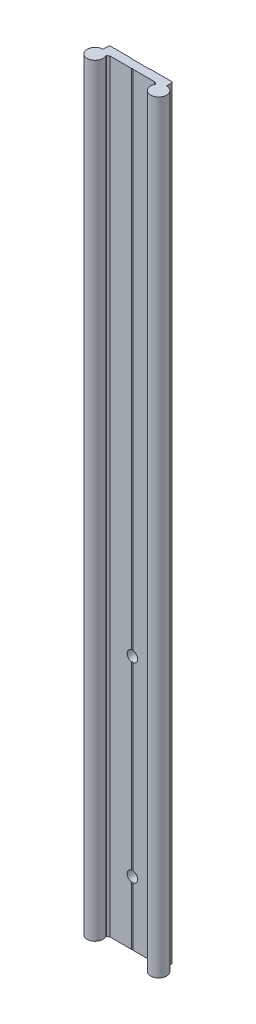
ISO-10303-21;
HEADER;
FILE_DESCRIPTION(('STEP AP214'),'2;1');
FILE_NAME('part.step','',(''),(''),'','','');
FILE_SCHEMA(('AUTOMOTIVE_DESIGN { 1 0 10303 214 1 1 1 1 }'));
ENDSEC;
DATA;
#1=APPLICATION_CONTEXT('core data for automotive mechanical design processes');
#2=APPLICATION_PROTOCOL_DEFINITION('international standard','automotive_design',2000,#1);
#3=PRODUCT_CONTEXT('',#1,'mechanical');
#4=PRODUCT('Part','Part','',(#3));
#5=PRODUCT_RELATED_PRODUCT_CATEGORY('part','',(#4));
#6=PRODUCT_DEFINITION_FORMATION('','',#4);
#7=PRODUCT_DEFINITION_CONTEXT('part definition',#1,'design');
#8=PRODUCT_DEFINITION('design','',#6,#7);
#9=PRODUCT_DEFINITION_SHAPE('','',#8);
#10=(LENGTH_UNIT() NAMED_UNIT(*) SI_UNIT(.MILLI.,.METRE.));
#11=(NAMED_UNIT(*) PLANE_ANGLE_UNIT() SI_UNIT($,.RADIAN.));
#12=(NAMED_UNIT(*) SI_UNIT($,.STERADIAN.) SOLID_ANGLE_UNIT());
#13=UNCERTAINTY_MEASURE_WITH_UNIT(LENGTH_MEASURE(1.E-05),#10,'distance_accuracy_value','');
#14=(GEOMETRIC_REPRESENTATION_CONTEXT(3) GLOBAL_UNCERTAINTY_ASSIGNED_CONTEXT((#13)) GLOBAL_UNIT_ASSIGNED_CONTEXT((#10,
#11,#12)) REPRESENTATION_CONTEXT('',''));
#15=CARTESIAN_POINT('',(0.,0.,0.));
#16=DIRECTION('',(0.,0.,1.));
#17=DIRECTION('',(1.,0.,0.));
#18=AXIS2_PLACEMENT_3D('',#15,#16,#17);
#19=CARTESIAN_POINT('',(19.75,0.,0.25));
#20=DIRECTION('',(0.707106781186548,0.,-0.707106781186548));
#21=DIRECTION('',(-0.707106781186548,0.,-0.707106781186548));
#22=AXIS2_PLACEMENT_3D('',#19,#20,#21);
#23=PLANE('',#22);
#24=DIRECTION('',(-0.707106781186548,0.,-0.707106781186548));
#25=VECTOR('',#24,1.);
#26=CARTESIAN_POINT('',(19.75,0.,0.25));
#27=LINE('',#26,#25);
#28=CARTESIAN_POINT('',(20.,0.,0.5));
#29=VERTEX_POINT('',#28);
#30=CARTESIAN_POINT('',(19.5,0.,0.));
#31=VERTEX_POINT('',#30);
#32=EDGE_CURVE('E123',#29,#31,#27,.T.);
#33=ORIENTED_EDGE('',*,*,#32,.T.);
#34=DIRECTION('',(0.,1.,0.));
#35=VECTOR('',#34,1.);
#36=CARTESIAN_POINT('',(19.5,0.,0.));
#37=LINE('',#36,#35);
#38=CARTESIAN_POINT('',(19.5,480.,0.));
#39=VERTEX_POINT('',#38);
#40=EDGE_CURVE('E376',#39,#31,#37,.F.);
#41=ORIENTED_EDGE('',*,*,#40,.F.);
#42=DIRECTION('',(-0.707106781186547,0.,-0.707106781186547));
#43=VECTOR('',#42,1.);
#44=CARTESIAN_POINT('',(20.,480.,0.5));
#45=LINE('',#44,#43);
#46=CARTESIAN_POINT('',(20.,480.,0.5));
#47=VERTEX_POINT('',#46);
#48=EDGE_CURVE('E293',#47,#39,#45,.T.);
#49=ORIENTED_EDGE('',*,*,#48,.F.);
#50=DIRECTION('',(0.,1.,0.));
#51=VECTOR('',#50,1.);
#52=CARTESIAN_POINT('',(20.,0.,0.5));
#53=LINE('',#52,#51);
#54=EDGE_CURVE('E368',#29,#47,#53,.T.);
#55=ORIENTED_EDGE('',*,*,#54,.F.);
#56=EDGE_LOOP('',(#33,#41,#49,#55));
#57=FACE_BOUND('',#56,.T.);
#58=ADVANCED_FACE('F32',(#57),#23,.T.);
#59=CARTESIAN_POINT('',(20.3,0.,3.70849738));
#60=DIRECTION('',(0.,1.,0.));
#61=DIRECTION('',(0.,0.,1.));
#62=AXIS2_PLACEMENT_3D('',#59,#60,#61);
#63=CYLINDRICAL_SURFACE('',#62,0.300000003500001);
#64=DIRECTION('',(0.,1.,0.));
#65=VECTOR('',#64,1.);
#66=CARTESIAN_POINT('',(20.2830188700676,0.,4.00801639874632));
#67=LINE('',#66,#65);
#68=CARTESIAN_POINT('',(20.2830188688936,0.,4.00801639929363));
#69=VERTEX_POINT('',#68);
#70=CARTESIAN_POINT('',(20.2830188689836,480.,4.00801639770649));
#71=VERTEX_POINT('',#70);
#72=EDGE_CURVE('E366',#69,#71,#67,.T.);
#73=ORIENTED_EDGE('',*,*,#72,.F.);
#74=CARTESIAN_POINT('',(20.3,0.,3.70849738));
#75=DIRECTION('',(0.,1.,0.));
#76=DIRECTION('',(0.,0.,1.));
#77=AXIS2_PLACEMENT_3D('',#74,#75,#76);
#78=CIRCLE('',#77,0.300000003500001);
#79=CARTESIAN_POINT('',(20.,0.,3.70849738));
#80=VERTEX_POINT('',#79);
#81=EDGE_CURVE('E35',#80,#69,#78,.T.);
#82=ORIENTED_EDGE('',*,*,#81,.F.);
#83=DIRECTION('',(0.,1.,0.));
#84=VECTOR('',#83,1.);
#85=CARTESIAN_POINT('',(20.,0.,3.70849738));
#86=LINE('',#85,#84);
#87=CARTESIAN_POINT('',(19.9999999982714,480.,3.70849738));
#88=VERTEX_POINT('',#87);
#89=EDGE_CURVE('E369',#88,#80,#86,.F.);
#90=ORIENTED_EDGE('',*,*,#89,.F.);
#91=CARTESIAN_POINT('',(20.3,480.,3.70849738));
#92=DIRECTION('',(0.,-1.,0.));
#93=DIRECTION('',(0.,0.,1.));
#94=AXIS2_PLACEMENT_3D('',#91,#92,#93);
#95=CIRCLE('',#94,0.300000001728561);
#96=EDGE_CURVE('E287',#71,#88,#95,.T.);
#97=ORIENTED_EDGE('',*,*,#96,.F.);
#98=EDGE_LOOP('',(#73,#82,#90,#97));
#99=FACE_BOUND('',#98,.T.);
#100=ADVANCED_FACE('F491',(#99),#63,.F.);
#101=CARTESIAN_POINT('',(15.28152165,0.,6.58629703));
#102=DIRECTION('',(0.,1.,0.));
#103=DIRECTION('',(0.,0.,1.));
#104=AXIS2_PLACEMENT_3D('',#101,#102,#103);
#105=CYLINDRICAL_SURFACE('',#104,0.299999998999998);
#106=DIRECTION('',(0.,1.,0.));
#107=VECTOR('',#106,1.);
#108=CARTESIAN_POINT('',(15.43152165,0.,6.32648941));
#109=LINE('',#108,#107);
#110=CARTESIAN_POINT('',(15.4315216497557,0.,6.32648940985894));
#111=VERTEX_POINT('',#110);
#112=CARTESIAN_POINT('',(15.4315216497557,480.,6.32648940985894));
#113=VERTEX_POINT('',#112);
#114=EDGE_CURVE('E411',#111,#113,#109,.T.);
#115=ORIENTED_EDGE('',*,*,#114,.F.);
#116=CARTESIAN_POINT('',(15.28152165,0.,6.58629703));
#117=DIRECTION('',(0.,1.,0.));
#118=DIRECTION('',(0.,0.,1.));
#119=AXIS2_PLACEMENT_3D('',#116,#117,#118);
#120=CIRCLE('',#119,0.299999998999998);
#121=CARTESIAN_POINT('',(15.5486053297196,0.,6.72292172801594));
#122=VERTEX_POINT('',#121);
#123=EDGE_CURVE('E417',#122,#111,#120,.T.);
#124=ORIENTED_EDGE('',*,*,#123,.F.);
#125=DIRECTION('',(0.,1.,0.));
#126=VECTOR('',#125,1.);
#127=CARTESIAN_POINT('',(15.5486053299831,0.,6.72292172999147));
#128=LINE('',#127,#126);
#129=CARTESIAN_POINT('',(15.5486053289735,480.,6.72292172763426));
#130=VERTEX_POINT('',#129);
#131=EDGE_CURVE('E363',#130,#122,#128,.F.);
#132=ORIENTED_EDGE('',*,*,#131,.F.);
#133=CARTESIAN_POINT('',(15.28152165,480.,6.58629703));
#134=DIRECTION('',(0.,-1.,0.));
#135=DIRECTION('',(0.,0.,1.));
#136=AXIS2_PLACEMENT_3D('',#133,#134,#135);
#137=CIRCLE('',#136,0.299999999296135);
#138=EDGE_CURVE('E281',#113,#130,#137,.T.);
#139=ORIENTED_EDGE('',*,*,#138,.F.);
#140=EDGE_LOOP('',(#115,#124,#132,#139));
#141=FACE_BOUND('',#140,.T.);
#142=ADVANCED_FACE('F499',(#141),#105,.F.);
#143=CARTESIAN_POINT('',(0.25,0.,5.355662435));
#144=DIRECTION('',(-0.499999994031163,0.,0.866025407230548));
#145=DIRECTION('',(0.866025407230548,0.,0.499999994031163));
#146=AXIS2_PLACEMENT_3D('',#143,#144,#145);
#147=PLANE('',#146);
#148=CARTESIAN_POINT('',(0.,40.,5.21132487));
#149=DIRECTION('',(-0.499999994031163,0.,0.866025407230548));
#150=DIRECTION('',(-0.866025407230548,0.,-0.499999994031163));
#151=AXIS2_PLACEMENT_3D('',#148,#149,#150);
#152=ELLIPSE('',#151,3.81051176148865,3.3);
#153=CARTESIAN_POINT('',(0.,43.3,5.21132487));
#154=VERTEX_POINT('',#153);
#155=CARTESIAN_POINT('',(0.499999999999999,43.26190128606,5.5));
#156=VERTEX_POINT('',#155);
#157=EDGE_CURVE('E390',#154,#156,#152,.F.);
#158=ORIENTED_EDGE('',*,*,#157,.T.);
#159=DIRECTION('',(0.,1.,0.));
#160=VECTOR('',#159,1.);
#161=CARTESIAN_POINT('',(0.5,0.,5.5));
#162=LINE('',#161,#160);
#163=CARTESIAN_POINT('',(0.499999999999999,156.73809871394,5.5));
#164=VERTEX_POINT('',#163);
#165=EDGE_CURVE('E359',#164,#156,#162,.F.);
#166=ORIENTED_EDGE('',*,*,#165,.F.);
#167=CARTESIAN_POINT('',(0.,160.,5.21132487));
#168=DIRECTION('',(-0.499999994031163,0.,0.866025407230548));
#169=DIRECTION('',(-0.866025407230548,0.,-0.499999994031163));
#170=AXIS2_PLACEMENT_3D('',#167,#168,#169);
#171=ELLIPSE('',#170,3.81051176148865,3.3);
#172=CARTESIAN_POINT('',(0.,156.7,5.21132487));
#173=VERTEX_POINT('',#172);
#174=EDGE_CURVE('E393',#164,#173,#171,.F.);
#175=ORIENTED_EDGE('',*,*,#174,.T.);
#176=DIRECTION('',(0.,1.,0.));
#177=VECTOR('',#176,1.);
#178=CARTESIAN_POINT('',(0.,0.,5.21132487));
#179=LINE('',#178,#177);
#180=EDGE_CURVE('E394',#154,#173,#179,.T.);
#181=ORIENTED_EDGE('',*,*,#180,.F.);
#182=EDGE_LOOP('',(#158,#166,#175,#181));
#183=FACE_BOUND('',#182,.T.);
#184=ADVANCED_FACE('F806',(#183),#147,.T.);
#185=CARTESIAN_POINT('',(0.25,0.,5.355662435));
#186=DIRECTION('',(-0.499999994031163,0.,0.866025407230548));
#187=DIRECTION('',(0.866025407230548,0.,0.499999994031163));
#188=AXIS2_PLACEMENT_3D('',#185,#186,#187);
#189=PLANE('',#188);
#190=DIRECTION('',(0.866025407230548,0.,0.499999994031163));
#191=VECTOR('',#190,1.);
#192=CARTESIAN_POINT('',(0.25,0.,5.355662435));
#193=LINE('',#192,#191);
#194=CARTESIAN_POINT('',(0.,0.,5.21132487));
#195=VERTEX_POINT('',#194);
#196=CARTESIAN_POINT('',(0.5,0.,5.5));
#197=VERTEX_POINT('',#196);
#198=EDGE_CURVE('E414',#195,#197,#193,.T.);
#199=ORIENTED_EDGE('',*,*,#198,.T.);
#200=DIRECTION('',(0.,1.,0.));
#201=VECTOR('',#200,1.);
#202=CARTESIAN_POINT('',(0.5,0.,5.5));
#203=LINE('',#202,#201);
#204=CARTESIAN_POINT('',(0.499999999999999,36.73809871394,5.5));
#205=VERTEX_POINT('',#204);
#206=EDGE_CURVE('E353',#205,#197,#203,.F.);
#207=ORIENTED_EDGE('',*,*,#206,.F.);
#208=CARTESIAN_POINT('',(0.,40.,5.21132487));
#209=DIRECTION('',(-0.499999994031163,0.,0.866025407230548));
#210=DIRECTION('',(-0.866025407230548,0.,-0.499999994031163));
#211=AXIS2_PLACEMENT_3D('',#208,#209,#210);
#212=ELLIPSE('',#211,3.81051176148865,3.3);
#213=CARTESIAN_POINT('',(0.,36.7,5.21132487));
#214=VERTEX_POINT('',#213);
#215=EDGE_CURVE('E476',#205,#214,#212,.F.);
#216=ORIENTED_EDGE('',*,*,#215,.T.);
#217=DIRECTION('',(0.,1.,0.));
#218=VECTOR('',#217,1.);
#219=CARTESIAN_POINT('',(0.,0.,5.21132487));
#220=LINE('',#219,#218);
#221=EDGE_CURVE('E399',#195,#214,#220,.T.);
#222=ORIENTED_EDGE('',*,*,#221,.F.);
#223=EDGE_LOOP('',(#199,#207,#216,#222));
#224=FACE_BOUND('',#223,.T.);
#225=ADVANCED_FACE('F510',(#224),#189,.T.);
#226=CARTESIAN_POINT('',(14.715760825,0.,5.913244705));
#227=DIRECTION('',(-0.500000000009856,0.,0.866025403778748));
#228=DIRECTION('',(0.866025403778748,0.,0.500000000009856));
#229=AXIS2_PLACEMENT_3D('',#226,#227,#228);
#230=PLANE('',#229);
#231=DIRECTION('',(0.866025403778748,0.,0.500000000009856));
#232=VECTOR('',#231,1.);
#233=CARTESIAN_POINT('',(14.715760825,0.,5.913244705));
#234=LINE('',#233,#232);
#235=CARTESIAN_POINT('',(14.,0.,5.5));
#236=VERTEX_POINT('',#235);
#237=EDGE_CURVE('E416',#236,#111,#234,.T.);
#238=ORIENTED_EDGE('',*,*,#237,.T.);
#239=ORIENTED_EDGE('',*,*,#114,.T.);
#240=DIRECTION('',(0.866025403778748,0.,0.500000000009856));
#241=VECTOR('',#240,1.);
#242=CARTESIAN_POINT('',(14.,480.,5.5));
#243=LINE('',#242,#241);
#244=CARTESIAN_POINT('',(14.,480.,5.5));
#245=VERTEX_POINT('',#244);
#246=EDGE_CURVE('E278',#245,#113,#243,.T.);
#247=ORIENTED_EDGE('',*,*,#246,.F.);
#248=DIRECTION('',(0.,1.,0.));
#249=VECTOR('',#248,1.);
#250=CARTESIAN_POINT('',(14.,0.,5.5));
#251=LINE('',#250,#249);
#252=EDGE_CURVE('E350',#236,#245,#251,.T.);
#253=ORIENTED_EDGE('',*,*,#252,.F.);
#254=EDGE_LOOP('',(#238,#239,#247,#253));
#255=FACE_BOUND('',#254,.T.);
#256=ADVANCED_FACE('F502',(#255),#230,.T.);
#257=CARTESIAN_POINT('',(0.25,0.,5.355662435));
#258=DIRECTION('',(-0.499999994031163,0.,0.866025407230548));
#259=DIRECTION('',(0.866025407230548,0.,0.499999994031163));
#260=AXIS2_PLACEMENT_3D('',#257,#258,#259);
#261=PLANE('',#260);
#262=DIRECTION('',(0.,1.,0.));
#263=VECTOR('',#262,1.);
#264=CARTESIAN_POINT('',(0.5,0.,5.5));
#265=LINE('',#264,#263);
#266=CARTESIAN_POINT('',(0.5,480.,5.5));
#267=VERTEX_POINT('',#266);
#268=CARTESIAN_POINT('',(0.499999999999999,163.26190128606,5.5));
#269=VERTEX_POINT('',#268);
#270=EDGE_CURVE('E347',#267,#269,#265,.F.);
#271=ORIENTED_EDGE('',*,*,#270,.F.);
#272=DIRECTION('',(0.866025407230549,0.,0.499999994031162));
#273=VECTOR('',#272,1.);
#274=CARTESIAN_POINT('',(0.,480.,5.21132487));
#275=LINE('',#274,#273);
#276=CARTESIAN_POINT('',(0.,480.,5.21132487));
#277=VERTEX_POINT('',#276);
#278=EDGE_CURVE('E272',#277,#267,#275,.T.);
#279=ORIENTED_EDGE('',*,*,#278,.F.);
#280=DIRECTION('',(0.,1.,0.));
#281=VECTOR('',#280,1.);
#282=CARTESIAN_POINT('',(0.,0.,5.21132487));
#283=LINE('',#282,#281);
#284=CARTESIAN_POINT('',(0.,163.3,5.21132487));
#285=VERTEX_POINT('',#284);
#286=EDGE_CURVE('E407',#285,#277,#283,.T.);
#287=ORIENTED_EDGE('',*,*,#286,.F.);
#288=CARTESIAN_POINT('',(0.,160.,5.21132487));
#289=DIRECTION('',(-0.499999994031163,0.,0.866025407230548));
#290=DIRECTION('',(-0.866025407230548,0.,-0.499999994031163));
#291=AXIS2_PLACEMENT_3D('',#288,#289,#290);
#292=ELLIPSE('',#291,3.81051176148865,3.3);
#293=EDGE_CURVE('E478',#285,#269,#292,.F.);
#294=ORIENTED_EDGE('',*,*,#293,.T.);
#295=EDGE_LOOP('',(#271,#279,#287,#294));
#296=FACE_BOUND('',#295,.T.);
#297=ADVANCED_FACE('F594',(#296),#261,.T.);
#298=CARTESIAN_POINT('',(-0.25,0.,5.355662435));
#299=DIRECTION('',(0.499999994031163,0.,0.866025407230548));
#300=DIRECTION('',(0.866025407230548,0.,-0.499999994031163));
#301=AXIS2_PLACEMENT_3D('',#298,#299,#300);
#302=PLANE('',#301);
#303=ORIENTED_EDGE('',*,*,#286,.T.);
#304=DIRECTION('',(0.866025407230549,0.,-0.499999994031162));
#305=VECTOR('',#304,1.);
#306=CARTESIAN_POINT('',(-0.5,480.,5.5));
#307=LINE('',#306,#305);
#308=CARTESIAN_POINT('',(-0.5,480.,5.5));
#309=VERTEX_POINT('',#308);
#310=EDGE_CURVE('E269',#309,#277,#307,.T.);
#311=ORIENTED_EDGE('',*,*,#310,.F.);
#312=DIRECTION('',(0.,1.,0.));
#313=VECTOR('',#312,1.);
#314=CARTESIAN_POINT('',(-0.5,0.,5.5));
#315=LINE('',#314,#313);
#316=CARTESIAN_POINT('',(-0.499999999999999,163.26190128606,5.5));
#317=VERTEX_POINT('',#316);
#318=EDGE_CURVE('E342',#317,#309,#315,.T.);
#319=ORIENTED_EDGE('',*,*,#318,.F.);
#320=CARTESIAN_POINT('',(0.,160.,5.21132487));
#321=DIRECTION('',(0.499999994031163,0.,0.866025407230548));
#322=DIRECTION('',(0.866025407230548,0.,-0.499999994031163));
#323=AXIS2_PLACEMENT_3D('',#320,#321,#322);
#324=ELLIPSE('',#323,3.81051176148865,3.3);
#325=EDGE_CURVE('E481',#317,#285,#324,.F.);
#326=ORIENTED_EDGE('',*,*,#325,.T.);
#327=EDGE_LOOP('',(#303,#311,#319,#326));
#328=FACE_BOUND('',#327,.T.);
#329=ADVANCED_FACE('F602',(#328),#302,.T.);
#330=CARTESIAN_POINT('',(-0.25,0.,5.355662435));
#331=DIRECTION('',(0.499999994031163,0.,0.866025407230548));
#332=DIRECTION('',(0.866025407230548,0.,-0.499999994031163));
#333=AXIS2_PLACEMENT_3D('',#330,#331,#332);
#334=PLANE('',#333);
#335=DIRECTION('',(0.866025407230548,0.,-0.499999994031163));
#336=VECTOR('',#335,1.);
#337=CARTESIAN_POINT('',(-0.25,0.,5.355662435));
#338=LINE('',#337,#336);
#339=CARTESIAN_POINT('',(-0.5,0.,5.5));
#340=VERTEX_POINT('',#339);
#341=EDGE_CURVE('E402',#340,#195,#338,.T.);
#342=ORIENTED_EDGE('',*,*,#341,.T.);
#343=ORIENTED_EDGE('',*,*,#221,.T.);
#344=CARTESIAN_POINT('',(0.,40.,5.21132487));
#345=DIRECTION('',(0.499999994031163,0.,0.866025407230548));
#346=DIRECTION('',(0.866025407230548,0.,-0.499999994031163));
#347=AXIS2_PLACEMENT_3D('',#344,#345,#346);
#348=ELLIPSE('',#347,3.81051176148865,3.3);
#349=CARTESIAN_POINT('',(-0.499999999999999,36.73809871394,5.5));
#350=VERTEX_POINT('',#349);
#351=EDGE_CURVE('E473',#214,#350,#348,.F.);
#352=ORIENTED_EDGE('',*,*,#351,.T.);
#353=DIRECTION('',(0.,1.,0.));
#354=VECTOR('',#353,1.);
#355=CARTESIAN_POINT('',(-0.5,0.,5.5));
#356=LINE('',#355,#354);
#357=EDGE_CURVE('E336',#340,#350,#356,.T.);
#358=ORIENTED_EDGE('',*,*,#357,.F.);
#359=EDGE_LOOP('',(#342,#343,#352,#358));
#360=FACE_BOUND('',#359,.T.);
#361=ADVANCED_FACE('F514',(#360),#334,.T.);
#362=CARTESIAN_POINT('',(-0.25,0.,5.355662435));
#363=DIRECTION('',(0.499999994031163,0.,0.866025407230548));
#364=DIRECTION('',(0.866025407230548,0.,-0.499999994031163));
#365=AXIS2_PLACEMENT_3D('',#362,#363,#364);
#366=PLANE('',#365);
#367=CARTESIAN_POINT('',(0.,40.,5.21132487));
#368=DIRECTION('',(0.499999994031163,0.,0.866025407230548));
#369=DIRECTION('',(0.866025407230548,0.,-0.499999994031163));
#370=AXIS2_PLACEMENT_3D('',#367,#368,#369);
#371=ELLIPSE('',#370,3.81051176148865,3.3);
#372=CARTESIAN_POINT('',(-0.499999999999999,43.26190128606,5.5));
#373=VERTEX_POINT('',#372);
#374=EDGE_CURVE('E470',#373,#154,#371,.F.);
#375=ORIENTED_EDGE('',*,*,#374,.T.);
#376=ORIENTED_EDGE('',*,*,#180,.T.);
#377=CARTESIAN_POINT('',(0.,160.,5.21132487));
#378=DIRECTION('',(0.499999994031163,0.,0.866025407230548));
#379=DIRECTION('',(0.866025407230548,0.,-0.499999994031163));
#380=AXIS2_PLACEMENT_3D('',#377,#378,#379);
#381=ELLIPSE('',#380,3.81051176148865,3.3);
#382=CARTESIAN_POINT('',(-0.499999999999999,156.73809871394,5.5));
#383=VERTEX_POINT('',#382);
#384=EDGE_CURVE('E484',#173,#383,#381,.F.);
#385=ORIENTED_EDGE('',*,*,#384,.T.);
#386=DIRECTION('',(0.,1.,0.));
#387=VECTOR('',#386,1.);
#388=CARTESIAN_POINT('',(-0.5,0.,5.5));
#389=LINE('',#388,#387);
#390=EDGE_CURVE('E326',#373,#383,#389,.T.);
#391=ORIENTED_EDGE('',*,*,#390,.F.);
#392=EDGE_LOOP('',(#375,#376,#385,#391));
#393=FACE_BOUND('',#392,.T.);
#394=ADVANCED_FACE('F615',(#393),#366,.T.);
#395=CARTESIAN_POINT('',(-19.75,0.,0.25));
#396=DIRECTION('',(-0.707106781186548,0.,-0.707106781186548));
#397=DIRECTION('',(-0.707106781186548,0.,0.707106781186548));
#398=AXIS2_PLACEMENT_3D('',#395,#396,#397);
#399=PLANE('',#398);
#400=DIRECTION('',(-0.707106781186548,0.,0.707106781186548));
#401=VECTOR('',#400,1.);
#402=CARTESIAN_POINT('',(-19.75,0.,0.25));
#403=LINE('',#402,#401);
#404=CARTESIAN_POINT('',(-19.5,0.,0.));
#405=VERTEX_POINT('',#404);
#406=CARTESIAN_POINT('',(-20.,0.,0.5));
#407=VERTEX_POINT('',#406);
#408=EDGE_CURVE('E391',#405,#407,#403,.T.);
#409=ORIENTED_EDGE('',*,*,#408,.T.);
#410=DIRECTION('',(0.,1.,0.));
#411=VECTOR('',#410,1.);
#412=CARTESIAN_POINT('',(-20.,0.,0.5));
#413=LINE('',#412,#411);
#414=CARTESIAN_POINT('',(-20.,480.,0.5));
#415=VERTEX_POINT('',#414);
#416=EDGE_CURVE('E323',#415,#407,#413,.F.);
#417=ORIENTED_EDGE('',*,*,#416,.F.);
#418=DIRECTION('',(-0.707106781186548,0.,0.707106781186547));
#419=VECTOR('',#418,1.);
#420=CARTESIAN_POINT('',(-19.5,480.,0.));
#421=LINE('',#420,#419);
#422=CARTESIAN_POINT('',(-19.5,480.,0.));
#423=VERTEX_POINT('',#422);
#424=EDGE_CURVE('E248',#423,#415,#421,.T.);
#425=ORIENTED_EDGE('',*,*,#424,.F.);
#426=DIRECTION('',(0.,1.,0.));
#427=VECTOR('',#426,1.);
#428=CARTESIAN_POINT('',(-19.5,0.,0.));
#429=LINE('',#428,#427);
#430=EDGE_CURVE('E320',#405,#423,#429,.T.);
#431=ORIENTED_EDGE('',*,*,#430,.F.);
#432=EDGE_LOOP('',(#409,#417,#425,#431));
#433=FACE_BOUND('',#432,.T.);
#434=ADVANCED_FACE('F542',(#433),#399,.T.);
#435=CARTESIAN_POINT('',(0.,160.,2.85));
#436=DIRECTION('',(0.,0.,-1.));
#437=DIRECTION('',(-1.,0.,0.));
#438=AXIS2_PLACEMENT_3D('',#435,#436,#437);
#439=CYLINDRICAL_SURFACE('',#438,3.3);
#440=CARTESIAN_POINT('',(0.,160.,5.5));
#441=DIRECTION('',(0.,0.,-1.));
#442=DIRECTION('',(-1.,0.,0.));
#443=AXIS2_PLACEMENT_3D('',#440,#441,#442);
#444=CIRCLE('',#443,3.3);
#445=EDGE_CURVE('E344',#383,#317,#444,.T.);
#446=ORIENTED_EDGE('',*,*,#445,.F.);
#447=ORIENTED_EDGE('',*,*,#384,.F.);
#448=ORIENTED_EDGE('',*,*,#174,.F.);
#449=CARTESIAN_POINT('',(0.,160.,5.5));
#450=DIRECTION('',(0.,0.,-1.));
#451=DIRECTION('',(-1.,0.,0.));
#452=AXIS2_PLACEMENT_3D('',#449,#450,#451);
#453=CIRCLE('',#452,3.3);
#454=EDGE_CURVE('E362',#269,#164,#453,.T.);
#455=ORIENTED_EDGE('',*,*,#454,.F.);
#456=ORIENTED_EDGE('',*,*,#293,.F.);
#457=ORIENTED_EDGE('',*,*,#325,.F.);
#458=EDGE_LOOP('',(#446,#447,#448,#455,#456,#457));
#459=FACE_BOUND('',#458,.T.);
#460=CARTESIAN_POINT('',(0.,160.,0.2));
#461=DIRECTION('',(0.,0.,-1.));
#462=DIRECTION('',(-1.,0.,0.));
#463=AXIS2_PLACEMENT_3D('',#460,#461,#462);
#464=CIRCLE('',#463,3.3);
#465=CARTESIAN_POINT('',(-3.3,160.,0.2));
#466=VERTEX_POINT('',#465);
#467=EDGE_CURVE('E428',#466,#466,#464,.F.);
#468=ORIENTED_EDGE('',*,*,#467,.F.);
#469=EDGE_LOOP('',(#468));
#470=FACE_BOUND('',#469,.T.);
#471=ADVANCED_FACE('F636',(#459,#470),#439,.F.);
#472=CARTESIAN_POINT('',(0.,40.,2.85));
#473=DIRECTION('',(0.,0.,-1.));
#474=DIRECTION('',(-1.,0.,0.));
#475=AXIS2_PLACEMENT_3D('',#472,#473,#474);
#476=CYLINDRICAL_SURFACE('',#475,3.3);
#477=CARTESIAN_POINT('',(0.,40.,5.5));
#478=DIRECTION('',(0.,0.,-1.));
#479=DIRECTION('',(-1.,0.,0.));
#480=AXIS2_PLACEMENT_3D('',#477,#478,#479);
#481=CIRCLE('',#480,3.3);
#482=EDGE_CURVE('E335',#350,#373,#481,.T.);
#483=ORIENTED_EDGE('',*,*,#482,.F.);
#484=ORIENTED_EDGE('',*,*,#351,.F.);
#485=ORIENTED_EDGE('',*,*,#215,.F.);
#486=CARTESIAN_POINT('',(0.,40.,5.5));
#487=DIRECTION('',(0.,0.,-1.));
#488=DIRECTION('',(-1.,0.,0.));
#489=AXIS2_PLACEMENT_3D('',#486,#487,#488);
#490=CIRCLE('',#489,3.3);
#491=EDGE_CURVE('E356',#156,#205,#490,.T.);
#492=ORIENTED_EDGE('',*,*,#491,.F.);
#493=ORIENTED_EDGE('',*,*,#157,.F.);
#494=ORIENTED_EDGE('',*,*,#374,.F.);
#495=EDGE_LOOP('',(#483,#484,#485,#492,#493,#494));
#496=FACE_BOUND('',#495,.T.);
#497=CARTESIAN_POINT('',(0.,40.,0.2));
#498=DIRECTION('',(0.,0.,-1.));
#499=DIRECTION('',(-1.,0.,0.));
#500=AXIS2_PLACEMENT_3D('',#497,#498,#499);
#501=CIRCLE('',#500,3.3);
#502=CARTESIAN_POINT('',(-3.3,40.,0.2));
#503=VERTEX_POINT('',#502);
#504=EDGE_CURVE('E318',#503,#503,#501,.F.);
#505=ORIENTED_EDGE('',*,*,#504,.F.);
#506=EDGE_LOOP('',(#505));
#507=FACE_BOUND('',#506,.T.);
#508=ADVANCED_FACE('F650',(#496,#507),#476,.F.);
#509=CARTESIAN_POINT('',(5.9,0.,0.1));
#510=DIRECTION('',(-0.707106781186547,0.,-0.707106781186548));
#511=DIRECTION('',(-0.707106781186548,0.,0.707106781186547));
#512=AXIS2_PLACEMENT_3D('',#509,#510,#511);
#513=PLANE('',#512);
#514=DIRECTION('',(-0.707106781186548,0.,0.707106781186547));
#515=VECTOR('',#514,1.);
#516=CARTESIAN_POINT('',(5.9,0.,0.1));
#517=LINE('',#516,#515);
#518=CARTESIAN_POINT('',(6.,0.,0.));
#519=VERTEX_POINT('',#518);
#520=CARTESIAN_POINT('',(5.8,0.,0.2));
#521=VERTEX_POINT('',#520);
#522=EDGE_CURVE('E388',#519,#521,#517,.T.);
#523=ORIENTED_EDGE('',*,*,#522,.T.);
#524=DIRECTION('',(0.,1.,0.));
#525=VECTOR('',#524,1.);
#526=CARTESIAN_POINT('',(5.8,0.,0.2));
#527=LINE('',#526,#525);
#528=CARTESIAN_POINT('',(5.8,480.,0.2));
#529=VERTEX_POINT('',#528);
#530=EDGE_CURVE('E228',#529,#521,#527,.F.);
#531=ORIENTED_EDGE('',*,*,#530,.F.);
#532=DIRECTION('',(-0.707106781186549,0.,0.707106781186546));
#533=VECTOR('',#532,1.);
#534=CARTESIAN_POINT('',(6.,480.,0.));
#535=LINE('',#534,#533);
#536=CARTESIAN_POINT('',(6.,480.,0.));
#537=VERTEX_POINT('',#536);
#538=EDGE_CURVE('E244',#537,#529,#535,.T.);
#539=ORIENTED_EDGE('',*,*,#538,.F.);
#540=DIRECTION('',(0.,1.,0.));
#541=VECTOR('',#540,1.);
#542=CARTESIAN_POINT('',(6.,0.,0.));
#543=LINE('',#542,#541);
#544=EDGE_CURVE('E371',#519,#537,#543,.T.);
#545=ORIENTED_EDGE('',*,*,#544,.F.);
#546=EDGE_LOOP('',(#523,#531,#539,#545));
#547=FACE_BOUND('',#546,.T.);
#548=ADVANCED_FACE('F644',(#547),#513,.T.);
#549=CARTESIAN_POINT('',(-5.9,0.,0.1));
#550=DIRECTION('',(0.707106781186547,0.,-0.707106781186548));
#551=DIRECTION('',(-0.707106781186548,0.,-0.707106781186547));
#552=AXIS2_PLACEMENT_3D('',#549,#550,#551);
#553=PLANE('',#552);
#554=DIRECTION('',(-0.707106781186548,0.,-0.707106781186547));
#555=VECTOR('',#554,1.);
#556=CARTESIAN_POINT('',(-5.9,0.,0.1));
#557=LINE('',#556,#555);
#558=CARTESIAN_POINT('',(-5.8,0.,0.2));
#559=VERTEX_POINT('',#558);
#560=CARTESIAN_POINT('',(-6.,0.,0.));
#561=VERTEX_POINT('',#560);
#562=EDGE_CURVE('E385',#559,#561,#557,.T.);
#563=ORIENTED_EDGE('',*,*,#562,.T.);
#564=DIRECTION('',(0.,1.,0.));
#565=VECTOR('',#564,1.);
#566=CARTESIAN_POINT('',(-6.,0.,0.));
#567=LINE('',#566,#565);
#568=CARTESIAN_POINT('',(-6.,480.,0.));
#569=VERTEX_POINT('',#568);
#570=EDGE_CURVE('E234',#569,#561,#567,.F.);
#571=ORIENTED_EDGE('',*,*,#570,.F.);
#572=DIRECTION('',(-0.707106781186549,0.,-0.707106781186546));
#573=VECTOR('',#572,1.);
#574=CARTESIAN_POINT('',(-5.8,480.,0.2));
#575=LINE('',#574,#573);
#576=CARTESIAN_POINT('',(-5.8,480.,0.2));
#577=VERTEX_POINT('',#576);
#578=EDGE_CURVE('E231',#577,#569,#575,.T.);
#579=ORIENTED_EDGE('',*,*,#578,.F.);
#580=DIRECTION('',(0.,1.,0.));
#581=VECTOR('',#580,1.);
#582=CARTESIAN_POINT('',(-5.8,0.,0.2));
#583=LINE('',#582,#581);
#584=EDGE_CURVE('E217',#559,#577,#583,.T.);
#585=ORIENTED_EDGE('',*,*,#584,.F.);
#586=EDGE_LOOP('',(#563,#571,#579,#585));
#587=FACE_BOUND('',#586,.T.);
#588=ADVANCED_FACE('F232',(#587),#553,.T.);
#589=CARTESIAN_POINT('',(-20.3,0.,3.70849738));
#590=DIRECTION('',(0.,1.,0.));
#591=DIRECTION('',(0.,0.,1.));
#592=AXIS2_PLACEMENT_3D('',#589,#590,#591);
#593=CYLINDRICAL_SURFACE('',#592,0.299999999999997);
#594=DIRECTION('',(0.,1.,0.));
#595=VECTOR('',#594,1.);
#596=CARTESIAN_POINT('',(-20.,0.,3.70849738));
#597=LINE('',#596,#595);
#598=CARTESIAN_POINT('',(-20.,0.,3.70849738));
#599=VERTEX_POINT('',#598);
#600=CARTESIAN_POINT('',(-20.,480.,3.70849738));
#601=VERTEX_POINT('',#600);
#602=EDGE_CURVE('E321',#599,#601,#597,.T.);
#603=ORIENTED_EDGE('',*,*,#602,.F.);
#604=CARTESIAN_POINT('',(-20.3,0.,3.70849738));
#605=DIRECTION('',(0.,1.,0.));
#606=DIRECTION('',(0.,0.,1.));
#607=AXIS2_PLACEMENT_3D('',#604,#605,#606);
#608=CIRCLE('',#607,0.299999999999997);
#609=CARTESIAN_POINT('',(-20.2830188689741,0.,4.00801639818839));
#610=VERTEX_POINT('',#609);
#611=EDGE_CURVE('E387',#610,#599,#608,.T.);
#612=ORIENTED_EDGE('',*,*,#611,.F.);
#613=DIRECTION('',(0.,1.,0.));
#614=VECTOR('',#613,1.);
#615=CARTESIAN_POINT('',(-20.2830188699984,0.,4.00801640002843));
#616=LINE('',#615,#614);
#617=CARTESIAN_POINT('',(-20.2830188690496,480.,4.00801639685621));
#618=VERTEX_POINT('',#617);
#619=EDGE_CURVE('E227',#618,#610,#616,.F.);
#620=ORIENTED_EDGE('',*,*,#619,.F.);
#621=CARTESIAN_POINT('',(-20.3,480.,3.70849738));
#622=DIRECTION('',(0.,-1.,0.));
#623=DIRECTION('',(0.,0.,1.));
#624=AXIS2_PLACEMENT_3D('',#621,#622,#623);
#625=CIRCLE('',#624,0.300000000444776);
#626=EDGE_CURVE('E254',#601,#618,#625,.T.);
#627=ORIENTED_EDGE('',*,*,#626,.F.);
#628=EDGE_LOOP('',(#603,#612,#620,#627));
#629=FACE_BOUND('',#628,.T.);
#630=ADVANCED_FACE('F533',(#629),#593,.F.);
#631=CARTESIAN_POINT('',(-14.715760825,0.,5.91324470499998));
#632=DIRECTION('',(0.500000000009856,0.,0.866025403778748));
#633=DIRECTION('',(0.866025403778748,0.,-0.500000000009856));
#634=AXIS2_PLACEMENT_3D('',#631,#632,#633);
#635=PLANE('',#634);
#636=DIRECTION('',(-0.866025404469381,0.,0.499999998813646));
#637=VECTOR('',#636,1.);
#638=CARTESIAN_POINT('',(-14.,0.,5.5));
#639=LINE('',#638,#637);
#640=CARTESIAN_POINT('',(-14.,0.,5.5));
#641=VERTEX_POINT('',#640);
#642=CARTESIAN_POINT('',(-15.4315216507178,0.,6.326489407778));
#643=VERTEX_POINT('',#642);
#644=EDGE_CURVE('E303',#641,#643,#639,.T.);
#645=ORIENTED_EDGE('',*,*,#644,.F.);
#646=DIRECTION('',(0.,1.,0.));
#647=VECTOR('',#646,1.);
#648=CARTESIAN_POINT('',(-14.,0.,5.5));
#649=LINE('',#648,#647);
#650=CARTESIAN_POINT('',(-14.,480.,5.5));
#651=VERTEX_POINT('',#650);
#652=EDGE_CURVE('E339',#651,#641,#649,.F.);
#653=ORIENTED_EDGE('',*,*,#652,.F.);
#654=DIRECTION('',(0.866025403980827,0.,-0.499999999659846));
#655=VECTOR('',#654,1.);
#656=CARTESIAN_POINT('',(-15.4315216500897,480.,6.32648940928034));
#657=LINE('',#656,#655);
#658=CARTESIAN_POINT('',(-15.4315216494878,480.,6.3264894103228));
#659=VERTEX_POINT('',#658);
#660=EDGE_CURVE('E263',#659,#651,#657,.T.);
#661=ORIENTED_EDGE('',*,*,#660,.F.);
#662=DIRECTION('',(0.,1.,0.));
#663=VECTOR('',#662,1.);
#664=CARTESIAN_POINT('',(-15.4315216511415,0.,6.32648940802261));
#665=LINE('',#664,#663);
#666=EDGE_CURVE('E331',#659,#643,#665,.F.);
#667=ORIENTED_EDGE('',*,*,#666,.T.);
#668=EDGE_LOOP('',(#645,#653,#661,#667));
#669=FACE_BOUND('',#668,.T.);
#670=ADVANCED_FACE('F522',(#669),#635,.T.);
#671=CARTESIAN_POINT('',(12.75,0.,0.));
#672=DIRECTION('',(0.,0.,-1.));
#673=DIRECTION('',(-1.,0.,0.));
#674=AXIS2_PLACEMENT_3D('',#671,#672,#673);
#675=PLANE('',#674);
#676=DIRECTION('',(1.,0.,0.));
#677=VECTOR('',#676,1.);
#678=CARTESIAN_POINT('',(-7.7796083811088E-09,0.,0.));
#679=LINE('',#678,#677);
#680=EDGE_CURVE('E313',#519,#31,#679,.T.);
#681=ORIENTED_EDGE('',*,*,#680,.F.);
#682=ORIENTED_EDGE('',*,*,#544,.T.);
#683=DIRECTION('',(-1.,0.,0.));
#684=VECTOR('',#683,1.);
#685=CARTESIAN_POINT('',(19.5,480.,0.));
#686=LINE('',#685,#684);
#687=EDGE_CURVE('E296',#39,#537,#686,.T.);
#688=ORIENTED_EDGE('',*,*,#687,.F.);
#689=ORIENTED_EDGE('',*,*,#40,.T.);
#690=EDGE_LOOP('',(#681,#682,#688,#689));
#691=FACE_BOUND('',#690,.T.);
#692=ADVANCED_FACE('F683',(#691),#675,.T.);
#693=CARTESIAN_POINT('',(20.,0.,2.10424869));
#694=DIRECTION('',(1.,0.,0.));
#695=DIRECTION('',(0.,0.,-1.));
#696=AXIS2_PLACEMENT_3D('',#693,#694,#695);
#697=PLANE('',#696);
#698=DIRECTION('',(0.,0.,-1.));
#699=VECTOR('',#698,1.);
#700=CARTESIAN_POINT('',(20.,0.,5.21921116449749));
#701=LINE('',#700,#699);
#702=EDGE_CURVE('E310',#29,#80,#701,.F.);
#703=ORIENTED_EDGE('',*,*,#702,.F.);
#704=ORIENTED_EDGE('',*,*,#54,.T.);
#705=DIRECTION('',(4.49916864020629E-10,0.,-1.));
#706=VECTOR('',#705,1.);
#707=CARTESIAN_POINT('',(19.9999999985564,480.,3.70849738));
#708=LINE('',#707,#706);
#709=EDGE_CURVE('E290',#88,#47,#708,.T.);
#710=ORIENTED_EDGE('',*,*,#709,.F.);
#711=ORIENTED_EDGE('',*,*,#89,.T.);
#712=EDGE_LOOP('',(#703,#704,#710,#711));
#713=FACE_BOUND('',#712,.T.);
#714=ADVANCED_FACE('F694',(#713),#697,.T.);
#715=CARTESIAN_POINT('',(20.,0.,9.00000000000001));
#716=DIRECTION('',(0.,1.,0.));
#717=DIRECTION('',(0.,0.,1.));
#718=AXIS2_PLACEMENT_3D('',#715,#716,#717);
#719=CYLINDRICAL_SURFACE('',#718,4.99999999560001);
#720=ORIENTED_EDGE('',*,*,#131,.T.);
#721=CARTESIAN_POINT('',(20.,0.,9.00000000000001));
#722=DIRECTION('',(0.,1.,0.));
#723=DIRECTION('',(0.,0.,1.));
#724=AXIS2_PLACEMENT_3D('',#721,#722,#723);
#725=CIRCLE('',#724,4.99999999560001);
#726=EDGE_CURVE('E312',#69,#122,#725,.F.);
#727=ORIENTED_EDGE('',*,*,#726,.F.);
#728=ORIENTED_EDGE('',*,*,#72,.T.);
#729=CARTESIAN_POINT('',(20.,480.,9.00000000000001));
#730=DIRECTION('',(0.,1.,0.));
#731=DIRECTION('',(0.,0.,1.));
#732=AXIS2_PLACEMENT_3D('',#729,#730,#731);
#733=CIRCLE('',#732,4.99999999657682);
#734=EDGE_CURVE('E284',#130,#71,#733,.T.);
#735=ORIENTED_EDGE('',*,*,#734,.F.);
#736=EDGE_LOOP('',(#720,#727,#728,#735));
#737=FACE_BOUND('',#736,.T.);
#738=ADVANCED_FACE('F494',(#737),#719,.T.);
#739=CARTESIAN_POINT('',(7.25,0.,5.5));
#740=DIRECTION('',(0.,0.,1.));
#741=DIRECTION('',(1.,0.,0.));
#742=AXIS2_PLACEMENT_3D('',#739,#740,#741);
#743=PLANE('',#742);
#744=ORIENTED_EDGE('',*,*,#252,.T.);
#745=DIRECTION('',(1.,0.,0.));
#746=VECTOR('',#745,1.);
#747=CARTESIAN_POINT('',(0.5,480.,5.5));
#748=LINE('',#747,#746);
#749=EDGE_CURVE('E275',#267,#245,#748,.T.);
#750=ORIENTED_EDGE('',*,*,#749,.F.);
#751=ORIENTED_EDGE('',*,*,#270,.T.);
#752=ORIENTED_EDGE('',*,*,#454,.T.);
#753=ORIENTED_EDGE('',*,*,#165,.T.);
#754=ORIENTED_EDGE('',*,*,#491,.T.);
#755=ORIENTED_EDGE('',*,*,#206,.T.);
#756=DIRECTION('',(1.,0.,0.));
#757=VECTOR('',#756,1.);
#758=CARTESIAN_POINT('',(-7.7796083811088E-09,0.,5.5));
#759=LINE('',#758,#757);
#760=EDGE_CURVE('E379',#236,#197,#759,.F.);
#761=ORIENTED_EDGE('',*,*,#760,.F.);
#762=EDGE_LOOP('',(#744,#750,#751,#752,#753,#754,#755,#761));
#763=FACE_BOUND('',#762,.T.);
#764=ADVANCED_FACE('F506',(#763),#743,.T.);
#765=CARTESIAN_POINT('',(-7.25,0.,5.5));
#766=DIRECTION('',(0.,0.,1.));
#767=DIRECTION('',(1.,0.,0.));
#768=AXIS2_PLACEMENT_3D('',#765,#766,#767);
#769=PLANE('',#768);
#770=ORIENTED_EDGE('',*,*,#482,.T.);
#771=ORIENTED_EDGE('',*,*,#390,.T.);
#772=ORIENTED_EDGE('',*,*,#445,.T.);
#773=ORIENTED_EDGE('',*,*,#318,.T.);
#774=DIRECTION('',(1.,0.,0.));
#775=VECTOR('',#774,1.);
#776=CARTESIAN_POINT('',(-14.,480.,5.5));
#777=LINE('',#776,#775);
#778=EDGE_CURVE('E266',#651,#309,#777,.T.);
#779=ORIENTED_EDGE('',*,*,#778,.F.);
#780=ORIENTED_EDGE('',*,*,#652,.T.);
#781=DIRECTION('',(1.,0.,0.));
#782=VECTOR('',#781,1.);
#783=CARTESIAN_POINT('',(-7.7796083811088E-09,0.,5.5));
#784=LINE('',#783,#782);
#785=EDGE_CURVE('E307',#340,#641,#784,.F.);
#786=ORIENTED_EDGE('',*,*,#785,.F.);
#787=ORIENTED_EDGE('',*,*,#357,.T.);
#788=EDGE_LOOP('',(#770,#771,#772,#773,#779,#780,#786,#787));
#789=FACE_BOUND('',#788,.T.);
#790=ADVANCED_FACE('F518',(#789),#769,.T.);
#791=CARTESIAN_POINT('',(-20.,0.,2.10424869));
#792=DIRECTION('',(-1.,0.,0.));
#793=DIRECTION('',(0.,0.,1.));
#794=AXIS2_PLACEMENT_3D('',#791,#792,#793);
#795=PLANE('',#794);
#796=DIRECTION('',(0.,0.,-1.));
#797=VECTOR('',#796,1.);
#798=CARTESIAN_POINT('',(-20.,0.,5.21921116449749));
#799=LINE('',#798,#797);
#800=EDGE_CURVE('E299',#599,#407,#799,.T.);
#801=ORIENTED_EDGE('',*,*,#800,.F.);
#802=ORIENTED_EDGE('',*,*,#602,.T.);
#803=DIRECTION('',(0.,0.,1.));
#804=VECTOR('',#803,1.);
#805=CARTESIAN_POINT('',(-20.,480.,0.5));
#806=LINE('',#805,#804);
#807=EDGE_CURVE('E251',#415,#601,#806,.T.);
#808=ORIENTED_EDGE('',*,*,#807,.F.);
#809=ORIENTED_EDGE('',*,*,#416,.T.);
#810=EDGE_LOOP('',(#801,#802,#808,#809));
#811=FACE_BOUND('',#810,.T.);
#812=ADVANCED_FACE('F537',(#811),#795,.T.);
#813=CARTESIAN_POINT('',(-12.75,0.,0.));
#814=DIRECTION('',(0.,0.,-1.));
#815=DIRECTION('',(-1.,0.,0.));
#816=AXIS2_PLACEMENT_3D('',#813,#814,#815);
#817=PLANE('',#816);
#818=DIRECTION('',(1.,0.,0.));
#819=VECTOR('',#818,1.);
#820=CARTESIAN_POINT('',(-7.7796083811088E-09,0.,0.));
#821=LINE('',#820,#819);
#822=EDGE_CURVE('E302',#405,#561,#821,.T.);
#823=ORIENTED_EDGE('',*,*,#822,.F.);
#824=ORIENTED_EDGE('',*,*,#430,.T.);
#825=DIRECTION('',(-1.,0.,0.));
#826=VECTOR('',#825,1.);
#827=CARTESIAN_POINT('',(-6.,480.,0.));
#828=LINE('',#827,#826);
#829=EDGE_CURVE('E238',#569,#423,#828,.T.);
#830=ORIENTED_EDGE('',*,*,#829,.F.);
#831=ORIENTED_EDGE('',*,*,#570,.T.);
#832=EDGE_LOOP('',(#823,#824,#830,#831));
#833=FACE_BOUND('',#832,.T.);
#834=ADVANCED_FACE('F544',(#833),#817,.T.);
#835=CARTESIAN_POINT('',(2.9,0.,0.2));
#836=DIRECTION('',(0.,0.,-1.));
#837=DIRECTION('',(-1.,0.,0.));
#838=AXIS2_PLACEMENT_3D('',#835,#836,#837);
#839=PLANE('',#838);
#840=DIRECTION('',(1.,0.,0.));
#841=VECTOR('',#840,1.);
#842=CARTESIAN_POINT('',(-7.7796083811088E-09,0.,0.2));
#843=LINE('',#842,#841);
#844=EDGE_CURVE('E225',#559,#521,#843,.T.);
#845=ORIENTED_EDGE('',*,*,#844,.F.);
#846=ORIENTED_EDGE('',*,*,#584,.T.);
#847=DIRECTION('',(-1.,0.,0.));
#848=VECTOR('',#847,1.);
#849=CARTESIAN_POINT('',(5.8,480.,0.2));
#850=LINE('',#849,#848);
#851=EDGE_CURVE('E223',#529,#577,#850,.T.);
#852=ORIENTED_EDGE('',*,*,#851,.F.);
#853=ORIENTED_EDGE('',*,*,#530,.T.);
#854=EDGE_LOOP('',(#845,#846,#852,#853));
#855=FACE_BOUND('',#854,.T.);
#856=ORIENTED_EDGE('',*,*,#504,.T.);
#857=EDGE_LOOP('',(#856));
#858=FACE_BOUND('',#857,.T.);
#859=ORIENTED_EDGE('',*,*,#467,.T.);
#860=EDGE_LOOP('',(#859));
#861=FACE_BOUND('',#860,.T.);
#862=ADVANCED_FACE('F219',(#855,#858,#861),#839,.T.);
#863=CARTESIAN_POINT('',(-7.7796083811088E-09,0.,5.21921116449749));
#864=DIRECTION('',(0.,-1.,0.));
#865=DIRECTION('',(0.,0.,-1.));
#866=AXIS2_PLACEMENT_3D('',#863,#864,#865);
#867=PLANE('',#866);
#868=ORIENTED_EDGE('',*,*,#822,.T.);
#869=ORIENTED_EDGE('',*,*,#562,.F.);
#870=ORIENTED_EDGE('',*,*,#844,.T.);
#871=ORIENTED_EDGE('',*,*,#522,.F.);
#872=ORIENTED_EDGE('',*,*,#680,.T.);
#873=ORIENTED_EDGE('',*,*,#32,.F.);
#874=ORIENTED_EDGE('',*,*,#702,.T.);
#875=ORIENTED_EDGE('',*,*,#81,.T.);
#876=ORIENTED_EDGE('',*,*,#726,.T.);
#877=ORIENTED_EDGE('',*,*,#123,.T.);
#878=ORIENTED_EDGE('',*,*,#237,.F.);
#879=ORIENTED_EDGE('',*,*,#760,.T.);
#880=ORIENTED_EDGE('',*,*,#198,.F.);
#881=ORIENTED_EDGE('',*,*,#341,.F.);
#882=ORIENTED_EDGE('',*,*,#785,.T.);
#883=ORIENTED_EDGE('',*,*,#644,.T.);
#884=CARTESIAN_POINT('',(-15.28152165,0.,6.58629703));
#885=DIRECTION('',(0.,1.,0.));
#886=DIRECTION('',(0.,0.,1.));
#887=AXIS2_PLACEMENT_3D('',#884,#885,#886);
#888=CIRCLE('',#887,0.300000001299995);
#889=CARTESIAN_POINT('',(-15.5486053287835,0.,6.72292172781941));
#890=VERTEX_POINT('',#889);
#891=EDGE_CURVE('E50',#643,#890,#888,.T.);
#892=ORIENTED_EDGE('',*,*,#891,.T.);
#893=CARTESIAN_POINT('',(-20.,0.,9.00000001000002));
#894=DIRECTION('',(0.,1.,0.));
#895=DIRECTION('',(0.,0.,1.));
#896=AXIS2_PLACEMENT_3D('',#893,#894,#895);
#897=CIRCLE('',#896,5.00000000430002);
#898=EDGE_CURVE('E41',#610,#890,#897,.T.);
#899=ORIENTED_EDGE('',*,*,#898,.F.);
#900=ORIENTED_EDGE('',*,*,#611,.T.);
#901=ORIENTED_EDGE('',*,*,#800,.T.);
#902=ORIENTED_EDGE('',*,*,#408,.F.);
#903=EDGE_LOOP('',(#868,#869,#870,#871,#872,#873,#874,#875,#876,#877,#878,#879,#880,#881,#882,
#883,#892,#899,#900,#901,#902));
#904=FACE_BOUND('',#903,.T.);
#905=ADVANCED_FACE('F488',(#904),#867,.T.);
#906=CARTESIAN_POINT('',(-15.28152165,0.,6.58629703));
#907=DIRECTION('',(0.,1.,0.));
#908=DIRECTION('',(0.,0.,1.));
#909=AXIS2_PLACEMENT_3D('',#906,#907,#908);
#910=CYLINDRICAL_SURFACE('',#909,0.300000001299995);
#911=DIRECTION('',(0.,1.,0.));
#912=VECTOR('',#911,1.);
#913=CARTESIAN_POINT('',(-15.5486053262927,0.,6.72292172810231));
#914=LINE('',#913,#912);
#915=CARTESIAN_POINT('',(-15.548605325805,480.,6.72292172629575));
#916=VERTEX_POINT('',#915);
#917=EDGE_CURVE('E11',#890,#916,#914,.T.);
#918=ORIENTED_EDGE('',*,*,#917,.F.);
#919=ORIENTED_EDGE('',*,*,#891,.F.);
#920=ORIENTED_EDGE('',*,*,#666,.F.);
#921=CARTESIAN_POINT('',(-15.28152165,480.,6.58629703));
#922=DIRECTION('',(0.,-1.,0.));
#923=DIRECTION('',(0.,0.,1.));
#924=AXIS2_PLACEMENT_3D('',#921,#922,#923);
#925=CIRCLE('',#924,0.299999998481119);
#926=EDGE_CURVE('E260',#916,#659,#925,.T.);
#927=ORIENTED_EDGE('',*,*,#926,.F.);
#928=EDGE_LOOP('',(#918,#919,#920,#927));
#929=FACE_BOUND('',#928,.T.);
#930=ADVANCED_FACE('F525',(#929),#910,.F.);
#931=CARTESIAN_POINT('',(-20.,0.,9.00000001000002));
#932=DIRECTION('',(0.,1.,0.));
#933=DIRECTION('',(0.,0.,1.));
#934=AXIS2_PLACEMENT_3D('',#931,#932,#933);
#935=CYLINDRICAL_SURFACE('',#934,5.00000000430002);
#936=ORIENTED_EDGE('',*,*,#917,.T.);
#937=CARTESIAN_POINT('',(-20.,480.,9.00000001000002));
#938=DIRECTION('',(0.,1.,0.));
#939=DIRECTION('',(0.,0.,1.));
#940=AXIS2_PLACEMENT_3D('',#937,#938,#939);
#941=CIRCLE('',#940,5.00000000555695);
#942=EDGE_CURVE('E257',#618,#916,#941,.T.);
#943=ORIENTED_EDGE('',*,*,#942,.F.);
#944=ORIENTED_EDGE('',*,*,#619,.T.);
#945=ORIENTED_EDGE('',*,*,#898,.T.);
#946=EDGE_LOOP('',(#936,#943,#944,#945));
#947=FACE_BOUND('',#946,.T.);
#948=ADVANCED_FACE('F529',(#947),#935,.T.);
#949=CARTESIAN_POINT('',(-20.3,480.,3.70849738));
#950=DIRECTION('',(0.,1.,0.));
#951=DIRECTION('',(0.,0.,1.));
#952=AXIS2_PLACEMENT_3D('',#949,#950,#951);
#953=PLANE('',#952);
#954=ORIENTED_EDGE('',*,*,#851,.T.);
#955=ORIENTED_EDGE('',*,*,#578,.T.);
#956=ORIENTED_EDGE('',*,*,#829,.T.);
#957=ORIENTED_EDGE('',*,*,#424,.T.);
#958=ORIENTED_EDGE('',*,*,#807,.T.);
#959=ORIENTED_EDGE('',*,*,#626,.T.);
#960=ORIENTED_EDGE('',*,*,#942,.T.);
#961=ORIENTED_EDGE('',*,*,#926,.T.);
#962=ORIENTED_EDGE('',*,*,#660,.T.);
#963=ORIENTED_EDGE('',*,*,#778,.T.);
#964=ORIENTED_EDGE('',*,*,#310,.T.);
#965=ORIENTED_EDGE('',*,*,#278,.T.);
#966=ORIENTED_EDGE('',*,*,#749,.T.);
#967=ORIENTED_EDGE('',*,*,#246,.T.);
#968=ORIENTED_EDGE('',*,*,#138,.T.);
#969=ORIENTED_EDGE('',*,*,#734,.T.);
#970=ORIENTED_EDGE('',*,*,#96,.T.);
#971=ORIENTED_EDGE('',*,*,#709,.T.);
#972=ORIENTED_EDGE('',*,*,#48,.T.);
#973=ORIENTED_EDGE('',*,*,#687,.T.);
#974=ORIENTED_EDGE('',*,*,#538,.T.);
#975=EDGE_LOOP('',(#954,#955,#956,#957,#958,#959,#960,#961,#962,#963,#964,#965,#966,#967,#968,
#969,#970,#971,#972,#973,#974));
#976=FACE_BOUND('',#975,.T.);
#977=ADVANCED_FACE('F241',(#976),#953,.T.);
#978=CLOSED_SHELL('',(#58,#100,#142,#184,#225,#256,#297,#329,#361,#394,#434,#471,#508,#548,#588,
#630,#670,#692,#714,#738,#764,#790,#812,#834,#862,#905,#930,#948,#977));
#979=MANIFOLD_SOLID_BREP('B2',#978);
#980=ADVANCED_BREP_SHAPE_REPRESENTATION('',(#18,#979),#14);
#981=SHAPE_DEFINITION_REPRESENTATION(#9,#980);
ENDSEC;
END-ISO-10303-21;
